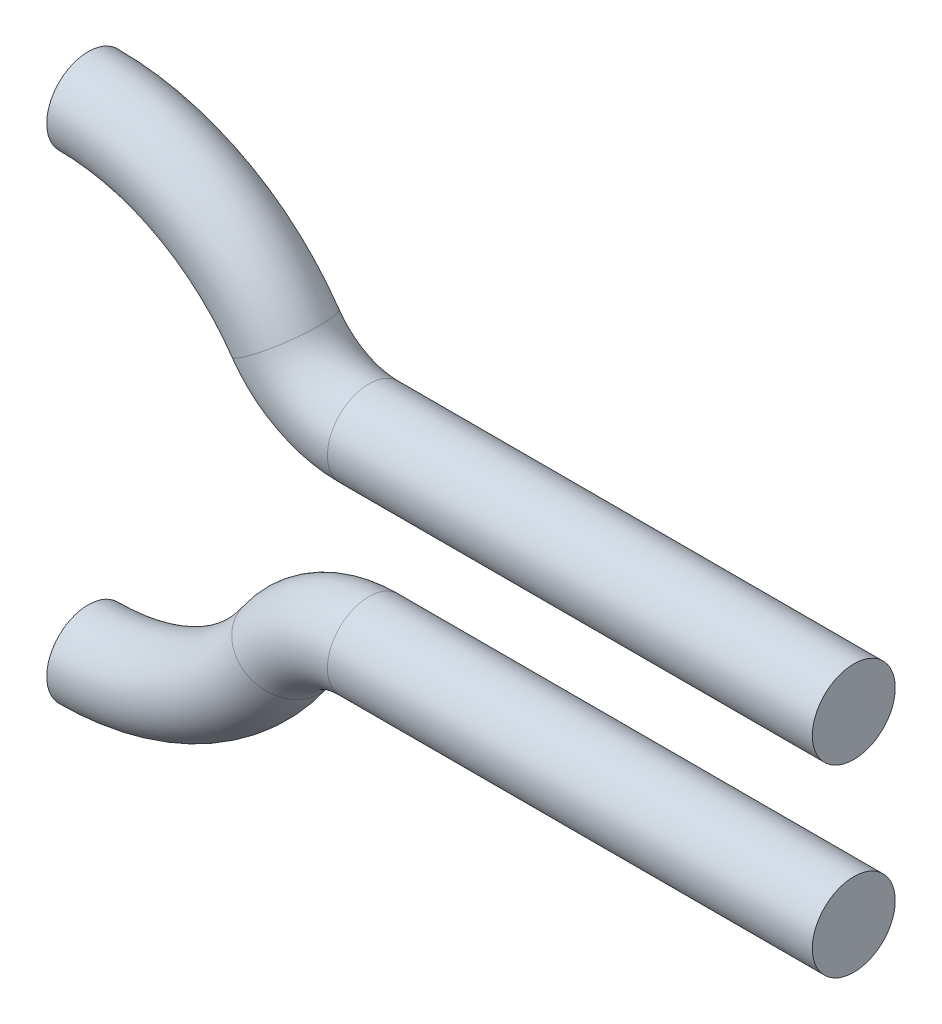
ISO-10303-21;
HEADER;
FILE_DESCRIPTION(('STEP AP214'),'2;1');
FILE_NAME('part.step','',(''),(''),'','','');
FILE_SCHEMA(('AUTOMOTIVE_DESIGN { 1 0 10303 214 1 1 1 1 }'));
ENDSEC;
DATA;
#1=APPLICATION_CONTEXT('core data for automotive mechanical design processes');
#2=APPLICATION_PROTOCOL_DEFINITION('international standard','automotive_design',2000,#1);
#3=PRODUCT_CONTEXT('',#1,'mechanical');
#4=PRODUCT('Part','Part','',(#3));
#5=PRODUCT_RELATED_PRODUCT_CATEGORY('part','',(#4));
#6=PRODUCT_DEFINITION_FORMATION('','',#4);
#7=PRODUCT_DEFINITION_CONTEXT('part definition',#1,'design');
#8=PRODUCT_DEFINITION('design','',#6,#7);
#9=PRODUCT_DEFINITION_SHAPE('','',#8);
#10=(LENGTH_UNIT() NAMED_UNIT(*) SI_UNIT(.MILLI.,.METRE.));
#11=(NAMED_UNIT(*) PLANE_ANGLE_UNIT() SI_UNIT($,.RADIAN.));
#12=(NAMED_UNIT(*) SI_UNIT($,.STERADIAN.) SOLID_ANGLE_UNIT());
#13=UNCERTAINTY_MEASURE_WITH_UNIT(LENGTH_MEASURE(1.E-05),#10,'distance_accuracy_value','');
#14=(GEOMETRIC_REPRESENTATION_CONTEXT(3) GLOBAL_UNCERTAINTY_ASSIGNED_CONTEXT((#13)) GLOBAL_UNIT_ASSIGNED_CONTEXT((#10,
#11,#12)) REPRESENTATION_CONTEXT('',''));
#15=CARTESIAN_POINT('',(0.,0.,0.));
#16=DIRECTION('',(0.,0.,1.));
#17=DIRECTION('',(1.,0.,0.));
#18=AXIS2_PLACEMENT_3D('',#15,#16,#17);
#19=CARTESIAN_POINT('',(41.5499546279118,0.,0.));
#20=DIRECTION('',(1.,0.,0.));
#21=DIRECTION('',(0.,1.,0.));
#22=AXIS2_PLACEMENT_3D('',#19,#20,#21);
#23=PLANE('',#22);
#24=CARTESIAN_POINT('',(41.5499546279118,-5.,9.1));
#25=DIRECTION('',(1.,0.,0.));
#26=DIRECTION('',(0.,-1.,0.));
#27=AXIS2_PLACEMENT_3D('',#24,#25,#26);
#28=CIRCLE('',#27,2.25);
#29=CARTESIAN_POINT('',(41.5499546279118,-7.25,9.1));
#30=VERTEX_POINT('',#29);
#31=EDGE_CURVE('P0_E10',#30,#30,#28,.T.);
#32=ORIENTED_EDGE('',*,*,#31,.T.);
#33=EDGE_LOOP('',(#32));
#34=FACE_BOUND('',#33,.T.);
#35=ADVANCED_FACE('P0_F15',(#34),#23,.T.);
#36=CARTESIAN_POINT('',(0.,-13.,9.1));
#37=DIRECTION('',(1.,0.,0.));
#38=DIRECTION('',(0.,-1.,0.));
#39=AXIS2_PLACEMENT_3D('',#36,#37,#38);
#40=PLANE('',#39);
#41=CARTESIAN_POINT('',(0.,-13.,9.1));
#42=DIRECTION('',(1.,0.,0.));
#43=DIRECTION('',(0.,-1.,0.));
#44=AXIS2_PLACEMENT_3D('',#41,#42,#43);
#45=CIRCLE('',#44,2.25);
#46=CARTESIAN_POINT('',(0.,-15.25,9.1));
#47=VERTEX_POINT('',#46);
#48=EDGE_CURVE('P0_E29',#47,#47,#45,.T.);
#49=ORIENTED_EDGE('',*,*,#48,.F.);
#50=EDGE_LOOP('',(#49));
#51=FACE_BOUND('',#50,.T.);
#52=ADVANCED_FACE('P0_F59',(#51),#40,.F.);
#53=CARTESIAN_POINT('',(77.5499546279118,-5.,9.1));
#54=DIRECTION('',(-1.,0.,0.));
#55=DIRECTION('',(0.,1.,0.));
#56=AXIS2_PLACEMENT_3D('',#53,#54,#55);
#57=CYLINDRICAL_SURFACE('',#56,2.25);
#58=CARTESIAN_POINT('',(15.2315462117278,-5.,9.1));
#59=DIRECTION('',(1.,0.,0.));
#60=DIRECTION('',(0.,-1.,0.));
#61=AXIS2_PLACEMENT_3D('',#58,#59,#60);
#62=CIRCLE('',#61,2.25);
#63=CARTESIAN_POINT('',(15.2315462117278,-2.75,9.1));
#64=VERTEX_POINT('',#63);
#65=EDGE_CURVE('P0_E22',#64,#64,#62,.T.);
#66=ORIENTED_EDGE('',*,*,#65,.T.);
#67=EDGE_LOOP('',(#66));
#68=FACE_BOUND('',#67,.T.);
#69=ORIENTED_EDGE('',*,*,#31,.F.);
#70=EDGE_LOOP('',(#69));
#71=FACE_BOUND('',#70,.T.);
#72=ADVANCED_FACE('P0_F55',(#68,#71),#57,.T.);
#73=CARTESIAN_POINT('',(15.2315462117278,-10.5,9.1));
#74=DIRECTION('',(0.,0.,1.));
#75=DIRECTION('',(0.,-1.,0.));
#76=AXIS2_PLACEMENT_3D('',#73,#74,#75);
#77=TOROIDAL_SURFACE('',#76,5.5,2.25);
#78=CARTESIAN_POINT('',(10.7032486893222,-7.37837837837837,9.1));
#79=DIRECTION('',(0.567567567567567,0.823326822255558,0.));
#80=DIRECTION('',(0.823326822255558,-0.567567567567567,0.));
#81=AXIS2_PLACEMENT_3D('',#78,#79,#80);
#82=CIRCLE('',#81,2.25);
#83=CARTESIAN_POINT('',(8.85076333924723,-6.10135135135135,9.1));
#84=VERTEX_POINT('',#83);
#85=EDGE_CURVE('P0_E36',#84,#84,#82,.T.);
#86=CARTESIAN_POINT('',(15.2315462117278,-10.5,9.1));
#87=DIRECTION('',(0.,0.,1.));
#88=DIRECTION('',(0.,-1.,0.));
#89=AXIS2_PLACEMENT_3D('',#86,#87,#88);
#90=CIRCLE('',#89,7.75);
#91=EDGE_CURVE('',#64,#84,#90,.T.);
#92=ORIENTED_EDGE('',*,*,#65,.F.);
#93=ORIENTED_EDGE('',*,*,#85,.T.);
#94=ORIENTED_EDGE('',*,*,#91,.T.);
#95=ORIENTED_EDGE('',*,*,#91,.F.);
#96=EDGE_LOOP('',(#92,#94,#93,#95));
#97=FACE_BOUND('',#96,.T.);
#98=ADVANCED_FACE('P0_F44',(#97),#77,.T.);
#99=CARTESIAN_POINT('',(0.,0.,9.1));
#100=DIRECTION('',(0.,0.,-1.));
#101=DIRECTION('',(0.,1.,0.));
#102=AXIS2_PLACEMENT_3D('',#99,#100,#101);
#103=TOROIDAL_SURFACE('',#102,13.,2.25);
#104=ORIENTED_EDGE('',*,*,#48,.T.);
#105=EDGE_LOOP('',(#104));
#106=FACE_BOUND('',#105,.T.);
#107=ORIENTED_EDGE('',*,*,#85,.F.);
#108=EDGE_LOOP('',(#107));
#109=FACE_BOUND('',#108,.T.);
#110=ADVANCED_FACE('P0_F47',(#106,#109),#103,.T.);
#111=CLOSED_SHELL('',(#35,#52,#72,#98,#110));
#112=MANIFOLD_SOLID_BREP('P0_B1',#111);
#113=CARTESIAN_POINT('',(41.5499546279118,0.,0.));
#114=DIRECTION('',(1.,0.,0.));
#115=DIRECTION('',(0.,1.,0.));
#116=AXIS2_PLACEMENT_3D('',#113,#114,#115);
#117=PLANE('',#116);
#118=CARTESIAN_POINT('',(41.5499546279118,5.,9.1));
#119=DIRECTION('',(1.,0.,0.));
#120=DIRECTION('',(0.,1.,0.));
#121=AXIS2_PLACEMENT_3D('',#118,#119,#120);
#122=CIRCLE('',#121,2.25);
#123=CARTESIAN_POINT('',(41.5499546279118,7.25,9.1));
#124=VERTEX_POINT('',#123);
#125=EDGE_CURVE('P1_E10',#124,#124,#122,.T.);
#126=ORIENTED_EDGE('',*,*,#125,.T.);
#127=EDGE_LOOP('',(#126));
#128=FACE_BOUND('',#127,.T.);
#129=ADVANCED_FACE('P1_F15',(#128),#117,.T.);
#130=CARTESIAN_POINT('',(0.,13.,9.1));
#131=DIRECTION('',(1.,0.,0.));
#132=DIRECTION('',(0.,1.,0.));
#133=AXIS2_PLACEMENT_3D('',#130,#131,#132);
#134=PLANE('',#133);
#135=CARTESIAN_POINT('',(0.,13.,9.1));
#136=DIRECTION('',(1.,0.,0.));
#137=DIRECTION('',(0.,1.,0.));
#138=AXIS2_PLACEMENT_3D('',#135,#136,#137);
#139=CIRCLE('',#138,2.25);
#140=CARTESIAN_POINT('',(0.,15.25,9.1));
#141=VERTEX_POINT('',#140);
#142=EDGE_CURVE('P1_E29',#141,#141,#139,.T.);
#143=ORIENTED_EDGE('',*,*,#142,.F.);
#144=EDGE_LOOP('',(#143));
#145=FACE_BOUND('',#144,.T.);
#146=ADVANCED_FACE('P1_F59',(#145),#134,.F.);
#147=CARTESIAN_POINT('',(77.5499546279118,5.,9.1));
#148=DIRECTION('',(-1.,0.,0.));
#149=DIRECTION('',(0.,-1.,0.));
#150=AXIS2_PLACEMENT_3D('',#147,#148,#149);
#151=CYLINDRICAL_SURFACE('',#150,2.25);
#152=CARTESIAN_POINT('',(15.2315462117278,5.,9.1));
#153=DIRECTION('',(1.,0.,0.));
#154=DIRECTION('',(0.,1.,0.));
#155=AXIS2_PLACEMENT_3D('',#152,#153,#154);
#156=CIRCLE('',#155,2.25);
#157=CARTESIAN_POINT('',(15.2315462117278,2.75,9.1));
#158=VERTEX_POINT('',#157);
#159=EDGE_CURVE('P1_E22',#158,#158,#156,.T.);
#160=ORIENTED_EDGE('',*,*,#159,.T.);
#161=EDGE_LOOP('',(#160));
#162=FACE_BOUND('',#161,.T.);
#163=ORIENTED_EDGE('',*,*,#125,.F.);
#164=EDGE_LOOP('',(#163));
#165=FACE_BOUND('',#164,.T.);
#166=ADVANCED_FACE('P1_F55',(#162,#165),#151,.T.);
#167=CARTESIAN_POINT('',(15.2315462117278,10.5,9.1));
#168=DIRECTION('',(0.,0.,-1.));
#169=DIRECTION('',(0.,1.,0.));
#170=AXIS2_PLACEMENT_3D('',#167,#168,#169);
#171=TOROIDAL_SURFACE('',#170,5.5,2.25);
#172=CARTESIAN_POINT('',(10.7032486893222,7.37837837837838,9.1));
#173=DIRECTION('',(0.567567567567567,-0.823326822255558,0.));
#174=DIRECTION('',(0.823326822255558,0.567567567567567,0.));
#175=AXIS2_PLACEMENT_3D('',#172,#173,#174);
#176=CIRCLE('',#175,2.25);
#177=CARTESIAN_POINT('',(8.85076333924722,6.10135135135136,9.1));
#178=VERTEX_POINT('',#177);
#179=EDGE_CURVE('P1_E36',#178,#178,#176,.T.);
#180=CARTESIAN_POINT('',(15.2315462117278,10.5,9.1));
#181=DIRECTION('',(0.,0.,-1.));
#182=DIRECTION('',(0.,1.,0.));
#183=AXIS2_PLACEMENT_3D('',#180,#181,#182);
#184=CIRCLE('',#183,7.75);
#185=EDGE_CURVE('',#158,#178,#184,.T.);
#186=ORIENTED_EDGE('',*,*,#159,.F.);
#187=ORIENTED_EDGE('',*,*,#179,.T.);
#188=ORIENTED_EDGE('',*,*,#185,.T.);
#189=ORIENTED_EDGE('',*,*,#185,.F.);
#190=EDGE_LOOP('',(#186,#188,#187,#189));
#191=FACE_BOUND('',#190,.T.);
#192=ADVANCED_FACE('P1_F44',(#191),#171,.T.);
#193=CARTESIAN_POINT('',(0.,0.,9.1));
#194=DIRECTION('',(0.,0.,1.));
#195=DIRECTION('',(0.,-1.,0.));
#196=AXIS2_PLACEMENT_3D('',#193,#194,#195);
#197=TOROIDAL_SURFACE('',#196,13.,2.25);
#198=ORIENTED_EDGE('',*,*,#142,.T.);
#199=EDGE_LOOP('',(#198));
#200=FACE_BOUND('',#199,.T.);
#201=ORIENTED_EDGE('',*,*,#179,.F.);
#202=EDGE_LOOP('',(#201));
#203=FACE_BOUND('',#202,.T.);
#204=ADVANCED_FACE('P1_F47',(#200,#203),#197,.T.);
#205=CLOSED_SHELL('',(#129,#146,#166,#192,#204));
#206=MANIFOLD_SOLID_BREP('P1_B1',#205);
#207=ADVANCED_BREP_SHAPE_REPRESENTATION('',(#18,#112,#206),#14);
#208=SHAPE_DEFINITION_REPRESENTATION(#9,#207);
ENDSEC;
END-ISO-10303-21;
